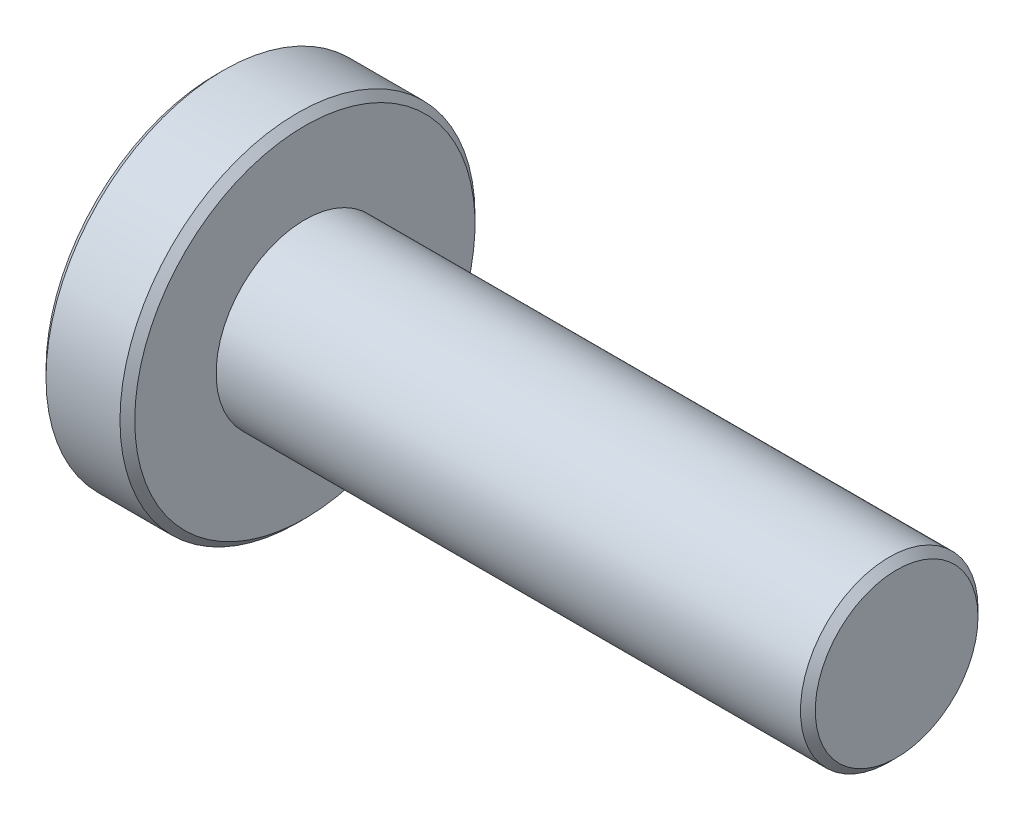
ISO-10303-21;
HEADER;
FILE_DESCRIPTION(('STEP AP214'),'2;1');
FILE_NAME('part.step','',(''),(''),'','','');
FILE_SCHEMA(('AUTOMOTIVE_DESIGN { 1 0 10303 214 1 1 1 1 }'));
ENDSEC;
DATA;
#1=APPLICATION_CONTEXT('core data for automotive mechanical design processes');
#2=APPLICATION_PROTOCOL_DEFINITION('international standard','automotive_design',2000,#1);
#3=PRODUCT_CONTEXT('',#1,'mechanical');
#4=PRODUCT('Part','Part','',(#3));
#5=PRODUCT_RELATED_PRODUCT_CATEGORY('part','',(#4));
#6=PRODUCT_DEFINITION_FORMATION('','',#4);
#7=PRODUCT_DEFINITION_CONTEXT('part definition',#1,'design');
#8=PRODUCT_DEFINITION('design','',#6,#7);
#9=PRODUCT_DEFINITION_SHAPE('','',#8);
#10=(LENGTH_UNIT() NAMED_UNIT(*) SI_UNIT(.MILLI.,.METRE.));
#11=(NAMED_UNIT(*) PLANE_ANGLE_UNIT() SI_UNIT($,.RADIAN.));
#12=(NAMED_UNIT(*) SI_UNIT($,.STERADIAN.) SOLID_ANGLE_UNIT());
#13=UNCERTAINTY_MEASURE_WITH_UNIT(LENGTH_MEASURE(1.E-05),#10,'distance_accuracy_value','');
#14=(GEOMETRIC_REPRESENTATION_CONTEXT(3) GLOBAL_UNCERTAINTY_ASSIGNED_CONTEXT((#13)) GLOBAL_UNIT_ASSIGNED_CONTEXT((#10,
#11,#12)) REPRESENTATION_CONTEXT('',''));
#15=CARTESIAN_POINT('',(0.,0.,0.));
#16=DIRECTION('',(0.,0.,1.));
#17=DIRECTION('',(1.,0.,0.));
#18=AXIS2_PLACEMENT_3D('',#15,#16,#17);
#19=CARTESIAN_POINT('',(20.,0.,0.));
#20=DIRECTION('',(-1.,0.,0.));
#21=DIRECTION('',(0.,0.,1.));
#22=AXIS2_PLACEMENT_3D('',#19,#20,#21);
#23=CYLINDRICAL_SURFACE('',#22,3.);
#24=CARTESIAN_POINT('',(19.75,0.,0.));
#25=DIRECTION('',(1.,0.,0.));
#26=DIRECTION('',(0.,0.,-1.));
#27=AXIS2_PLACEMENT_3D('',#24,#25,#26);
#28=CIRCLE('',#27,3.);
#29=CARTESIAN_POINT('',(19.75,0.,-3.));
#30=VERTEX_POINT('',#29);
#31=EDGE_CURVE('E10',#30,#30,#28,.F.);
#32=ORIENTED_EDGE('',*,*,#31,.T.);
#33=EDGE_LOOP('',(#32));
#34=FACE_BOUND('',#33,.T.);
#35=CARTESIAN_POINT('',(0.,0.,0.));
#36=DIRECTION('',(1.,0.,0.));
#37=DIRECTION('',(0.,0.,-1.));
#38=AXIS2_PLACEMENT_3D('',#35,#36,#37);
#39=CIRCLE('',#38,3.);
#40=CARTESIAN_POINT('',(0.,0.,-3.));
#41=VERTEX_POINT('',#40);
#42=EDGE_CURVE('E62',#41,#41,#39,.T.);
#43=ORIENTED_EDGE('',*,*,#42,.T.);
#44=EDGE_LOOP('',(#43));
#45=FACE_BOUND('',#44,.T.);
#46=ADVANCED_FACE('F35',(#34,#45),#23,.T.);
#47=CARTESIAN_POINT('',(20.,0.,0.));
#48=DIRECTION('',(1.,0.,0.));
#49=DIRECTION('',(0.,0.,-1.));
#50=AXIS2_PLACEMENT_3D('',#47,#48,#49);
#51=PLANE('',#50);
#52=CARTESIAN_POINT('',(20.,0.,0.));
#53=DIRECTION('',(1.,0.,0.));
#54=DIRECTION('',(0.,0.,-1.));
#55=AXIS2_PLACEMENT_3D('',#52,#53,#54);
#56=CIRCLE('',#55,2.75);
#57=CARTESIAN_POINT('',(20.,0.,-2.75));
#58=VERTEX_POINT('',#57);
#59=EDGE_CURVE('E43',#58,#58,#56,.T.);
#60=ORIENTED_EDGE('',*,*,#59,.T.);
#61=EDGE_LOOP('',(#60));
#62=FACE_BOUND('',#61,.T.);
#63=ADVANCED_FACE('F85',(#62),#51,.T.);
#64=CARTESIAN_POINT('',(-3.,0.,0.));
#65=DIRECTION('',(1.,0.,0.));
#66=DIRECTION('',(0.,0.,-1.));
#67=AXIS2_PLACEMENT_3D('',#64,#65,#66);
#68=CYLINDRICAL_SURFACE('',#67,6.);
#69=CARTESIAN_POINT('',(-2.75,0.,0.));
#70=DIRECTION('',(-1.,0.,0.));
#71=DIRECTION('',(0.,0.,1.));
#72=AXIS2_PLACEMENT_3D('',#69,#70,#71);
#73=CIRCLE('',#72,6.);
#74=CARTESIAN_POINT('',(-2.75,0.,6.));
#75=VERTEX_POINT('',#74);
#76=EDGE_CURVE('E51',#75,#75,#73,.F.);
#77=ORIENTED_EDGE('',*,*,#76,.T.);
#78=EDGE_LOOP('',(#77));
#79=FACE_BOUND('',#78,.T.);
#80=CARTESIAN_POINT('',(-0.249999999999999,0.,0.));
#81=DIRECTION('',(-1.,0.,0.));
#82=DIRECTION('',(0.,0.,1.));
#83=AXIS2_PLACEMENT_3D('',#80,#81,#82);
#84=CIRCLE('',#83,6.);
#85=CARTESIAN_POINT('',(-0.249999999999999,0.,6.));
#86=VERTEX_POINT('',#85);
#87=EDGE_CURVE('E56',#86,#86,#84,.T.);
#88=ORIENTED_EDGE('',*,*,#87,.T.);
#89=EDGE_LOOP('',(#88));
#90=FACE_BOUND('',#89,.T.);
#91=ADVANCED_FACE('F80',(#79,#90),#68,.T.);
#92=CARTESIAN_POINT('',(-3.,0.,0.));
#93=DIRECTION('',(-1.,0.,0.));
#94=DIRECTION('',(0.,0.,1.));
#95=AXIS2_PLACEMENT_3D('',#92,#93,#94);
#96=PLANE('',#95);
#97=CARTESIAN_POINT('',(-3.,0.,0.));
#98=DIRECTION('',(-1.,0.,0.));
#99=DIRECTION('',(0.,0.,1.));
#100=AXIS2_PLACEMENT_3D('',#97,#98,#99);
#101=CIRCLE('',#100,5.75000000000001);
#102=CARTESIAN_POINT('',(-3.,0.,5.75000000000001));
#103=VERTEX_POINT('',#102);
#104=EDGE_CURVE('E59',#103,#103,#101,.T.);
#105=ORIENTED_EDGE('',*,*,#104,.T.);
#106=EDGE_LOOP('',(#105));
#107=FACE_BOUND('',#106,.T.);
#108=ADVANCED_FACE('F70',(#107),#96,.T.);
#109=CARTESIAN_POINT('',(0.,0.,0.));
#110=DIRECTION('',(-1.,0.,0.));
#111=DIRECTION('',(0.,0.,1.));
#112=AXIS2_PLACEMENT_3D('',#109,#110,#111);
#113=PLANE('',#112);
#114=CARTESIAN_POINT('',(0.,0.,0.));
#115=DIRECTION('',(-1.,0.,0.));
#116=DIRECTION('',(0.,0.,1.));
#117=AXIS2_PLACEMENT_3D('',#114,#115,#116);
#118=CIRCLE('',#117,5.75);
#119=CARTESIAN_POINT('',(0.,0.,5.75));
#120=VERTEX_POINT('',#119);
#121=EDGE_CURVE('E47',#120,#120,#118,.F.);
#122=ORIENTED_EDGE('',*,*,#121,.T.);
#123=EDGE_LOOP('',(#122));
#124=FACE_BOUND('',#123,.T.);
#125=ORIENTED_EDGE('',*,*,#42,.F.);
#126=EDGE_LOOP('',(#125));
#127=FACE_BOUND('',#126,.T.);
#128=ADVANCED_FACE('F67',(#124,#127),#113,.F.);
#129=CARTESIAN_POINT('',(-3.,0.,0.));
#130=DIRECTION('',(1.,0.,0.));
#131=DIRECTION('',(0.,0.,-1.));
#132=AXIS2_PLACEMENT_3D('',#129,#130,#131);
#133=CONICAL_SURFACE('',#132,5.75000000000001,0.785398163397447);
#134=ORIENTED_EDGE('',*,*,#76,.F.);
#135=EDGE_LOOP('',(#134));
#136=FACE_BOUND('',#135,.T.);
#137=ORIENTED_EDGE('',*,*,#104,.F.);
#138=EDGE_LOOP('',(#137));
#139=FACE_BOUND('',#138,.T.);
#140=ADVANCED_FACE('F69',(#136,#139),#133,.T.);
#141=CARTESIAN_POINT('',(-0.249999999999999,0.,0.));
#142=DIRECTION('',(-1.,0.,0.));
#143=DIRECTION('',(0.,0.,1.));
#144=AXIS2_PLACEMENT_3D('',#141,#142,#143);
#145=CONICAL_SURFACE('',#144,6.,0.785398163397452);
#146=ORIENTED_EDGE('',*,*,#121,.F.);
#147=EDGE_LOOP('',(#146));
#148=FACE_BOUND('',#147,.T.);
#149=ORIENTED_EDGE('',*,*,#87,.F.);
#150=EDGE_LOOP('',(#149));
#151=FACE_BOUND('',#150,.T.);
#152=ADVANCED_FACE('F77',(#148,#151),#145,.T.);
#153=CARTESIAN_POINT('',(20.,0.,0.));
#154=DIRECTION('',(-1.,0.,0.));
#155=DIRECTION('',(0.,0.,1.));
#156=AXIS2_PLACEMENT_3D('',#153,#154,#155);
#157=CONICAL_SURFACE('',#156,2.75,0.785398163397444);
#158=ORIENTED_EDGE('',*,*,#31,.F.);
#159=EDGE_LOOP('',(#158));
#160=FACE_BOUND('',#159,.T.);
#161=ORIENTED_EDGE('',*,*,#59,.F.);
#162=EDGE_LOOP('',(#161));
#163=FACE_BOUND('',#162,.T.);
#164=ADVANCED_FACE('F38',(#160,#163),#157,.T.);
#165=CLOSED_SHELL('',(#46,#63,#91,#108,#128,#140,#152,#164));
#166=MANIFOLD_SOLID_BREP('B2',#165);
#167=ADVANCED_BREP_SHAPE_REPRESENTATION('',(#18,#166),#14);
#168=SHAPE_DEFINITION_REPRESENTATION(#9,#167);
ENDSEC;
END-ISO-10303-21;
